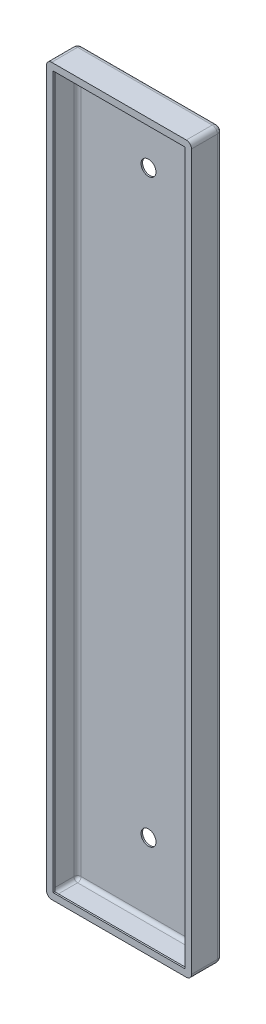
ISO-10303-21;
HEADER;
FILE_DESCRIPTION(('STEP AP214'),'2;1');
FILE_NAME('part.step','',(''),(''),'','','');
FILE_SCHEMA(('AUTOMOTIVE_DESIGN { 1 0 10303 214 1 1 1 1 }'));
ENDSEC;
DATA;
#1=APPLICATION_CONTEXT('core data for automotive mechanical design processes');
#2=APPLICATION_PROTOCOL_DEFINITION('international standard','automotive_design',2000,#1);
#3=PRODUCT_CONTEXT('',#1,'mechanical');
#4=PRODUCT('Part','Part','',(#3));
#5=PRODUCT_RELATED_PRODUCT_CATEGORY('part','',(#4));
#6=PRODUCT_DEFINITION_FORMATION('','',#4);
#7=PRODUCT_DEFINITION_CONTEXT('part definition',#1,'design');
#8=PRODUCT_DEFINITION('design','',#6,#7);
#9=PRODUCT_DEFINITION_SHAPE('','',#8);
#10=(LENGTH_UNIT() NAMED_UNIT(*) SI_UNIT(.MILLI.,.METRE.));
#11=(NAMED_UNIT(*) PLANE_ANGLE_UNIT() SI_UNIT($,.RADIAN.));
#12=(NAMED_UNIT(*) SI_UNIT($,.STERADIAN.) SOLID_ANGLE_UNIT());
#13=UNCERTAINTY_MEASURE_WITH_UNIT(LENGTH_MEASURE(1.E-05),#10,'distance_accuracy_value','');
#14=(GEOMETRIC_REPRESENTATION_CONTEXT(3) GLOBAL_UNCERTAINTY_ASSIGNED_CONTEXT((#13)) GLOBAL_UNIT_ASSIGNED_CONTEXT((#10,
#11,#12)) REPRESENTATION_CONTEXT('',''));
#15=CARTESIAN_POINT('',(0.,0.,0.));
#16=DIRECTION('',(0.,0.,1.));
#17=DIRECTION('',(1.,0.,0.));
#18=AXIS2_PLACEMENT_3D('',#15,#16,#17);
#19=CARTESIAN_POINT('',(350.,725.,63.7691453664121));
#20=DIRECTION('',(1.,0.,0.));
#21=DIRECTION('',(0.,1.,0.));
#22=AXIS2_PLACEMENT_3D('',#19,#20,#21);
#23=PLANE('',#22);
#24=DIRECTION('',(0.,0.,-1.));
#25=VECTOR('',#24,1.);
#26=CARTESIAN_POINT('',(350.,720.,63.7691453664121));
#27=LINE('',#26,#25);
#28=CARTESIAN_POINT('',(350.,720.,63.7691453664121));
#29=VERTEX_POINT('',#28);
#30=CARTESIAN_POINT('',(350.,720.,38.7691453664121));
#31=VERTEX_POINT('',#30);
#32=EDGE_CURVE('E376',#29,#31,#27,.T.);
#33=ORIENTED_EDGE('',*,*,#32,.T.);
#34=DIRECTION('',(0.,-1.,0.));
#35=VECTOR('',#34,1.);
#36=CARTESIAN_POINT('',(350.,725.,38.7691453664121));
#37=LINE('',#36,#35);
#38=CARTESIAN_POINT('',(350.,30.0000000000002,38.7691453664121));
#39=VERTEX_POINT('',#38);
#40=EDGE_CURVE('E378',#31,#39,#37,.T.);
#41=ORIENTED_EDGE('',*,*,#40,.T.);
#42=DIRECTION('',(0.,0.,-1.));
#43=VECTOR('',#42,1.);
#44=CARTESIAN_POINT('',(350.,30.0000000000002,63.7691453664121));
#45=LINE('',#44,#43);
#46=CARTESIAN_POINT('',(350.,30.0000000000002,63.7691453664121));
#47=VERTEX_POINT('',#46);
#48=EDGE_CURVE('E380',#39,#47,#45,.F.);
#49=ORIENTED_EDGE('',*,*,#48,.T.);
#50=DIRECTION('',(0.,-1.,0.));
#51=VECTOR('',#50,1.);
#52=CARTESIAN_POINT('',(350.,725.,63.7691453664121));
#53=LINE('',#52,#51);
#54=EDGE_CURVE('E335',#29,#47,#53,.T.);
#55=ORIENTED_EDGE('',*,*,#54,.F.);
#56=EDGE_LOOP('',(#33,#41,#49,#55));
#57=FACE_BOUND('',#56,.T.);
#58=ADVANCED_FACE('F39',(#57),#23,.F.);
#59=CARTESIAN_POINT('',(350.,25.0000000000002,63.7691453664121));
#60=DIRECTION('',(0.,1.,0.));
#61=DIRECTION('',(0.,0.,1.));
#62=AXIS2_PLACEMENT_3D('',#59,#60,#61);
#63=PLANE('',#62);
#64=DIRECTION('',(0.,0.,-1.));
#65=VECTOR('',#64,1.);
#66=CARTESIAN_POINT('',(355.,25.0000000000002,63.7691453664121));
#67=LINE('',#66,#65);
#68=CARTESIAN_POINT('',(355.,25.0000000000002,63.7691453664121));
#69=VERTEX_POINT('',#68);
#70=CARTESIAN_POINT('',(355.,25.0000000000002,38.7691453664121));
#71=VERTEX_POINT('',#70);
#72=EDGE_CURVE('E353',#69,#71,#67,.T.);
#73=ORIENTED_EDGE('',*,*,#72,.T.);
#74=DIRECTION('',(1.,0.,0.));
#75=VECTOR('',#74,1.);
#76=CARTESIAN_POINT('',(350.,25.0000000000002,38.7691453664121));
#77=LINE('',#76,#75);
#78=CARTESIAN_POINT('',(485.000000000006,25.0000000000002,38.7691453664121));
#79=VERTEX_POINT('',#78);
#80=EDGE_CURVE('E350',#71,#79,#77,.T.);
#81=ORIENTED_EDGE('',*,*,#80,.T.);
#82=DIRECTION('',(0.,0.,-1.));
#83=VECTOR('',#82,1.);
#84=CARTESIAN_POINT('',(485.000000000006,25.0000000000002,63.7691453664121));
#85=LINE('',#84,#83);
#86=CARTESIAN_POINT('',(485.000000000006,25.0000000000002,63.7691453664121));
#87=VERTEX_POINT('',#86);
#88=EDGE_CURVE('E348',#79,#87,#85,.F.);
#89=ORIENTED_EDGE('',*,*,#88,.T.);
#90=DIRECTION('',(1.,0.,0.));
#91=VECTOR('',#90,1.);
#92=CARTESIAN_POINT('',(350.,25.0000000000002,63.7691453664121));
#93=LINE('',#92,#91);
#94=EDGE_CURVE('E338',#69,#87,#93,.T.);
#95=ORIENTED_EDGE('',*,*,#94,.F.);
#96=EDGE_LOOP('',(#73,#81,#89,#95));
#97=FACE_BOUND('',#96,.T.);
#98=ADVANCED_FACE('F448',(#97),#63,.F.);
#99=CARTESIAN_POINT('',(490.000000000006,725.,63.7691453664121));
#100=DIRECTION('',(-1.,0.,0.));
#101=DIRECTION('',(0.,0.,1.));
#102=AXIS2_PLACEMENT_3D('',#99,#100,#101);
#103=PLANE('',#102);
#104=DIRECTION('',(0.,0.,-1.));
#105=VECTOR('',#104,1.);
#106=CARTESIAN_POINT('',(490.000000000006,30.0000000000002,63.7691453664121));
#107=LINE('',#106,#105);
#108=CARTESIAN_POINT('',(490.000000000006,30.0000000000002,63.7691453664121));
#109=VERTEX_POINT('',#108);
#110=CARTESIAN_POINT('',(490.000000000006,30.0000000000002,38.7691453664121));
#111=VERTEX_POINT('',#110);
#112=EDGE_CURVE('E368',#109,#111,#107,.T.);
#113=ORIENTED_EDGE('',*,*,#112,.T.);
#114=DIRECTION('',(0.,1.,0.));
#115=VECTOR('',#114,1.);
#116=CARTESIAN_POINT('',(490.000000000006,725.,38.7691453664121));
#117=LINE('',#116,#115);
#118=CARTESIAN_POINT('',(490.000000000006,720.,38.7691453664121));
#119=VERTEX_POINT('',#118);
#120=EDGE_CURVE('E366',#111,#119,#117,.T.);
#121=ORIENTED_EDGE('',*,*,#120,.T.);
#122=DIRECTION('',(0.,0.,-1.));
#123=VECTOR('',#122,1.);
#124=CARTESIAN_POINT('',(490.000000000006,720.,63.7691453664121));
#125=LINE('',#124,#123);
#126=CARTESIAN_POINT('',(490.000000000006,720.,63.7691453664121));
#127=VERTEX_POINT('',#126);
#128=EDGE_CURVE('E364',#119,#127,#125,.F.);
#129=ORIENTED_EDGE('',*,*,#128,.T.);
#130=DIRECTION('',(0.,1.,0.));
#131=VECTOR('',#130,1.);
#132=CARTESIAN_POINT('',(490.000000000006,725.,63.7691453664121));
#133=LINE('',#132,#131);
#134=EDGE_CURVE('E342',#109,#127,#133,.T.);
#135=ORIENTED_EDGE('',*,*,#134,.F.);
#136=EDGE_LOOP('',(#113,#121,#129,#135));
#137=FACE_BOUND('',#136,.T.);
#138=ADVANCED_FACE('F458',(#137),#103,.F.);
#139=CARTESIAN_POINT('',(350.,725.,63.7691453664121));
#140=DIRECTION('',(0.,-1.,0.));
#141=DIRECTION('',(0.,0.,-1.));
#142=AXIS2_PLACEMENT_3D('',#139,#140,#141);
#143=PLANE('',#142);
#144=DIRECTION('',(0.,0.,-1.));
#145=VECTOR('',#144,1.);
#146=CARTESIAN_POINT('',(485.000000000006,725.,63.7691453664121));
#147=LINE('',#146,#145);
#148=CARTESIAN_POINT('',(485.000000000006,725.,63.7691453664121));
#149=VERTEX_POINT('',#148);
#150=CARTESIAN_POINT('',(485.000000000006,725.,38.7691453664121));
#151=VERTEX_POINT('',#150);
#152=EDGE_CURVE('E370',#149,#151,#147,.T.);
#153=ORIENTED_EDGE('',*,*,#152,.T.);
#154=DIRECTION('',(-1.,0.,0.));
#155=VECTOR('',#154,1.);
#156=CARTESIAN_POINT('',(350.,725.,38.7691453664121));
#157=LINE('',#156,#155);
#158=CARTESIAN_POINT('',(355.,725.,38.7691453664121));
#159=VERTEX_POINT('',#158);
#160=EDGE_CURVE('E372',#151,#159,#157,.T.);
#161=ORIENTED_EDGE('',*,*,#160,.T.);
#162=DIRECTION('',(0.,0.,-1.));
#163=VECTOR('',#162,1.);
#164=CARTESIAN_POINT('',(355.,725.,63.7691453664121));
#165=LINE('',#164,#163);
#166=CARTESIAN_POINT('',(355.,725.,63.7691453664121));
#167=VERTEX_POINT('',#166);
#168=EDGE_CURVE('E374',#159,#167,#165,.F.);
#169=ORIENTED_EDGE('',*,*,#168,.T.);
#170=DIRECTION('',(-1.,0.,0.));
#171=VECTOR('',#170,1.);
#172=CARTESIAN_POINT('',(350.,725.,63.7691453664121));
#173=LINE('',#172,#171);
#174=EDGE_CURVE('E345',#149,#167,#173,.T.);
#175=ORIENTED_EDGE('',*,*,#174,.F.);
#176=EDGE_LOOP('',(#153,#161,#169,#175));
#177=FACE_BOUND('',#176,.T.);
#178=ADVANCED_FACE('F479',(#177),#143,.F.);
#179=CARTESIAN_POINT('',(0.,0.,63.7691453664121));
#180=DIRECTION('',(0.,0.,1.));
#181=DIRECTION('',(1.,0.,0.));
#182=AXIS2_PLACEMENT_3D('',#179,#180,#181);
#183=PLANE('',#182);
#184=ORIENTED_EDGE('',*,*,#54,.T.);
#185=CARTESIAN_POINT('',(355.,30.0000000000002,63.7691453664121));
#186=DIRECTION('',(0.,0.,1.));
#187=DIRECTION('',(1.,0.,0.));
#188=AXIS2_PLACEMENT_3D('',#185,#186,#187);
#189=CIRCLE('',#188,5.);
#190=EDGE_CURVE('E47',#47,#69,#189,.T.);
#191=ORIENTED_EDGE('',*,*,#190,.T.);
#192=ORIENTED_EDGE('',*,*,#94,.T.);
#193=CARTESIAN_POINT('',(485.000000000006,30.0000000000002,63.7691453664121));
#194=DIRECTION('',(0.,0.,1.));
#195=DIRECTION('',(1.,0.,0.));
#196=AXIS2_PLACEMENT_3D('',#193,#194,#195);
#197=CIRCLE('',#196,5.);
#198=EDGE_CURVE('E386',#87,#109,#197,.T.);
#199=ORIENTED_EDGE('',*,*,#198,.T.);
#200=ORIENTED_EDGE('',*,*,#134,.T.);
#201=CARTESIAN_POINT('',(485.000000000006,720.,63.7691453664121));
#202=DIRECTION('',(0.,0.,1.));
#203=DIRECTION('',(1.,0.,0.));
#204=AXIS2_PLACEMENT_3D('',#201,#202,#203);
#205=CIRCLE('',#204,5.);
#206=EDGE_CURVE('E382',#127,#149,#205,.T.);
#207=ORIENTED_EDGE('',*,*,#206,.T.);
#208=ORIENTED_EDGE('',*,*,#174,.T.);
#209=CARTESIAN_POINT('',(355.,720.,63.7691453664121));
#210=DIRECTION('',(0.,0.,1.));
#211=DIRECTION('',(1.,0.,0.));
#212=AXIS2_PLACEMENT_3D('',#209,#210,#211);
#213=CIRCLE('',#212,5.);
#214=EDGE_CURVE('E384',#167,#29,#213,.T.);
#215=ORIENTED_EDGE('',*,*,#214,.T.);
#216=EDGE_LOOP('',(#184,#191,#192,#199,#200,#207,#208,#215));
#217=FACE_BOUND('',#216,.T.);
#218=DIRECTION('',(0.,1.,0.));
#219=VECTOR('',#218,1.);
#220=CARTESIAN_POINT('',(483.500000000006,31.5000000000002,63.7691453664121));
#221=LINE('',#220,#219);
#222=CARTESIAN_POINT('',(483.500000000006,31.5000000000002,63.7691453664121));
#223=VERTEX_POINT('',#222);
#224=CARTESIAN_POINT('',(483.500000000006,718.5,63.7691453664121));
#225=VERTEX_POINT('',#224);
#226=EDGE_CURVE('E209',#223,#225,#221,.T.);
#227=ORIENTED_EDGE('',*,*,#226,.F.);
#228=DIRECTION('',(1.,0.,0.));
#229=VECTOR('',#228,1.);
#230=CARTESIAN_POINT('',(356.5,31.5000000000002,63.7691453664121));
#231=LINE('',#230,#229);
#232=CARTESIAN_POINT('',(356.5,31.5000000000002,63.7691453664121));
#233=VERTEX_POINT('',#232);
#234=EDGE_CURVE('E227',#233,#223,#231,.T.);
#235=ORIENTED_EDGE('',*,*,#234,.F.);
#236=DIRECTION('',(0.,-1.,0.));
#237=VECTOR('',#236,1.);
#238=CARTESIAN_POINT('',(356.5,718.5,63.7691453664121));
#239=LINE('',#238,#237);
#240=CARTESIAN_POINT('',(356.5,718.5,63.7691453664121));
#241=VERTEX_POINT('',#240);
#242=EDGE_CURVE('E230',#241,#233,#239,.T.);
#243=ORIENTED_EDGE('',*,*,#242,.F.);
#244=DIRECTION('',(-1.,0.,0.));
#245=VECTOR('',#244,1.);
#246=CARTESIAN_POINT('',(483.500000000006,718.5,63.7691453664121));
#247=LINE('',#246,#245);
#248=EDGE_CURVE('E239',#225,#241,#247,.T.);
#249=ORIENTED_EDGE('',*,*,#248,.F.);
#250=EDGE_LOOP('',(#227,#235,#243,#249));
#251=FACE_BOUND('',#250,.T.);
#252=ADVANCED_FACE('F444',(#217,#251),#183,.T.);
#253=CARTESIAN_POINT('',(0.,0.,33.7691453664121));
#254=DIRECTION('',(0.,0.,1.));
#255=DIRECTION('',(1.,0.,0.));
#256=AXIS2_PLACEMENT_3D('',#253,#254,#255);
#257=PLANE('',#256);
#258=CARTESIAN_POINT('',(420.000000000003,655.,33.7691453664121));
#259=DIRECTION('',(0.,0.,1.));
#260=DIRECTION('',(1.,0.,0.));
#261=AXIS2_PLACEMENT_3D('',#258,#259,#260);
#262=CIRCLE('',#261,7.22547934031754);
#263=CARTESIAN_POINT('',(427.225479340321,655.,33.7691453664121));
#264=VERTEX_POINT('',#263);
#265=EDGE_CURVE('E240',#264,#264,#262,.F.);
#266=ORIENTED_EDGE('',*,*,#265,.F.);
#267=EDGE_LOOP('',(#266));
#268=FACE_BOUND('',#267,.T.);
#269=CARTESIAN_POINT('',(420.000000000003,95.0000000000002,33.7691453664121));
#270=DIRECTION('',(0.,0.,1.));
#271=DIRECTION('',(1.,0.,0.));
#272=AXIS2_PLACEMENT_3D('',#269,#270,#271);
#273=CIRCLE('',#272,7.22547934031754);
#274=CARTESIAN_POINT('',(427.225479340321,95.0000000000002,33.7691453664121));
#275=VERTEX_POINT('',#274);
#276=EDGE_CURVE('E233',#275,#275,#273,.F.);
#277=ORIENTED_EDGE('',*,*,#276,.F.);
#278=EDGE_LOOP('',(#277));
#279=FACE_BOUND('',#278,.T.);
#280=DIRECTION('',(0.,1.,0.));
#281=VECTOR('',#280,1.);
#282=CARTESIAN_POINT('',(485.000000000006,0.,33.7691453664121));
#283=LINE('',#282,#281);
#284=CARTESIAN_POINT('',(485.000000000006,720.,33.7691453664121));
#285=VERTEX_POINT('',#284);
#286=CARTESIAN_POINT('',(485.000000000006,30.0000000000002,33.7691453664121));
#287=VERTEX_POINT('',#286);
#288=EDGE_CURVE('E359',#285,#287,#283,.F.);
#289=ORIENTED_EDGE('',*,*,#288,.T.);
#290=DIRECTION('',(1.,0.,0.));
#291=VECTOR('',#290,1.);
#292=CARTESIAN_POINT('',(0.,30.0000000000002,33.7691453664121));
#293=LINE('',#292,#291);
#294=CARTESIAN_POINT('',(355.,30.0000000000002,33.7691453664121));
#295=VERTEX_POINT('',#294);
#296=EDGE_CURVE('E361',#287,#295,#293,.F.);
#297=ORIENTED_EDGE('',*,*,#296,.T.);
#298=DIRECTION('',(0.,-1.,0.));
#299=VECTOR('',#298,1.);
#300=CARTESIAN_POINT('',(355.,0.,33.7691453664121));
#301=LINE('',#300,#299);
#302=CARTESIAN_POINT('',(355.,720.,33.7691453664121));
#303=VERTEX_POINT('',#302);
#304=EDGE_CURVE('E355',#295,#303,#301,.F.);
#305=ORIENTED_EDGE('',*,*,#304,.T.);
#306=DIRECTION('',(-1.,0.,0.));
#307=VECTOR('',#306,1.);
#308=CARTESIAN_POINT('',(0.,720.,33.7691453664121));
#309=LINE('',#308,#307);
#310=EDGE_CURVE('E357',#303,#285,#309,.F.);
#311=ORIENTED_EDGE('',*,*,#310,.T.);
#312=EDGE_LOOP('',(#289,#297,#305,#311));
#313=FACE_BOUND('',#312,.T.);
#314=ADVANCED_FACE('F475',(#268,#279,#313),#257,.F.);
#315=CARTESIAN_POINT('',(355.,720.,63.7691453664121));
#316=DIRECTION('',(0.,0.,-1.));
#317=DIRECTION('',(-1.,0.,0.));
#318=AXIS2_PLACEMENT_3D('',#315,#316,#317);
#319=CYLINDRICAL_SURFACE('',#318,5.);
#320=ORIENTED_EDGE('',*,*,#214,.F.);
#321=ORIENTED_EDGE('',*,*,#168,.F.);
#322=CARTESIAN_POINT('',(355.,720.,38.7691453664121));
#323=DIRECTION('',(0.,0.,-1.));
#324=DIRECTION('',(-1.,0.,0.));
#325=AXIS2_PLACEMENT_3D('',#322,#323,#324);
#326=CIRCLE('',#325,5.);
#327=EDGE_CURVE('E416',#31,#159,#326,.T.);
#328=ORIENTED_EDGE('',*,*,#327,.F.);
#329=ORIENTED_EDGE('',*,*,#32,.F.);
#330=EDGE_LOOP('',(#320,#321,#328,#329));
#331=FACE_BOUND('',#330,.T.);
#332=ADVANCED_FACE('F41',(#331),#319,.T.);
#333=CARTESIAN_POINT('',(485.000000000006,720.,63.7691453664121));
#334=DIRECTION('',(0.,0.,-1.));
#335=DIRECTION('',(-1.,0.,0.));
#336=AXIS2_PLACEMENT_3D('',#333,#334,#335);
#337=CYLINDRICAL_SURFACE('',#336,5.);
#338=ORIENTED_EDGE('',*,*,#206,.F.);
#339=ORIENTED_EDGE('',*,*,#128,.F.);
#340=CARTESIAN_POINT('',(485.000000000006,720.,38.7691453664121));
#341=DIRECTION('',(0.,0.,-1.));
#342=DIRECTION('',(-1.,0.,0.));
#343=AXIS2_PLACEMENT_3D('',#340,#341,#342);
#344=CIRCLE('',#343,5.);
#345=EDGE_CURVE('E413',#151,#119,#344,.T.);
#346=ORIENTED_EDGE('',*,*,#345,.F.);
#347=ORIENTED_EDGE('',*,*,#152,.F.);
#348=EDGE_LOOP('',(#338,#339,#346,#347));
#349=FACE_BOUND('',#348,.T.);
#350=ADVANCED_FACE('F463',(#349),#337,.T.);
#351=CARTESIAN_POINT('',(350.,720.,38.7691453664121));
#352=DIRECTION('',(-1.,0.,0.));
#353=DIRECTION('',(0.,0.,1.));
#354=AXIS2_PLACEMENT_3D('',#351,#352,#353);
#355=CYLINDRICAL_SURFACE('',#354,5.);
#356=CARTESIAN_POINT('',(355.,720.,38.7691453664121));
#357=DIRECTION('',(-1.,0.,0.));
#358=DIRECTION('',(0.,0.,1.));
#359=AXIS2_PLACEMENT_3D('',#356,#357,#358);
#360=CIRCLE('',#359,5.);
#361=EDGE_CURVE('E339',#159,#303,#360,.T.);
#362=ORIENTED_EDGE('',*,*,#361,.F.);
#363=ORIENTED_EDGE('',*,*,#160,.F.);
#364=CARTESIAN_POINT('',(485.000000000006,720.,38.7691453664121));
#365=DIRECTION('',(1.,0.,0.));
#366=DIRECTION('',(0.,0.,-1.));
#367=AXIS2_PLACEMENT_3D('',#364,#365,#366);
#368=CIRCLE('',#367,5.);
#369=EDGE_CURVE('E410',#285,#151,#368,.T.);
#370=ORIENTED_EDGE('',*,*,#369,.F.);
#371=ORIENTED_EDGE('',*,*,#310,.F.);
#372=EDGE_LOOP('',(#362,#363,#370,#371));
#373=FACE_BOUND('',#372,.T.);
#374=ADVANCED_FACE('F476',(#373),#355,.T.);
#375=CARTESIAN_POINT('',(355.,720.,38.7691453664121));
#376=DIRECTION('',(0.,1.,0.));
#377=DIRECTION('',(0.,0.,1.));
#378=AXIS2_PLACEMENT_3D('',#375,#376,#377);
#379=SPHERICAL_SURFACE('',#378,5.);
#380=ORIENTED_EDGE('',*,*,#327,.T.);
#381=ORIENTED_EDGE('',*,*,#361,.T.);
#382=CARTESIAN_POINT('',(355.,720.,38.7691453664121));
#383=DIRECTION('',(0.,1.,0.));
#384=DIRECTION('',(0.,0.,1.));
#385=AXIS2_PLACEMENT_3D('',#382,#383,#384);
#386=CIRCLE('',#385,5.);
#387=EDGE_CURVE('E407',#31,#303,#386,.F.);
#388=ORIENTED_EDGE('',*,*,#387,.F.);
#389=EDGE_LOOP('',(#380,#381,#388));
#390=FACE_BOUND('',#389,.T.);
#391=ADVANCED_FACE('F422',(#390),#379,.T.);
#392=CARTESIAN_POINT('',(485.000000000006,720.,38.7691453664121));
#393=DIRECTION('',(0.,1.,0.));
#394=DIRECTION('',(0.,0.,1.));
#395=AXIS2_PLACEMENT_3D('',#392,#393,#394);
#396=SPHERICAL_SURFACE('',#395,5.);
#397=ORIENTED_EDGE('',*,*,#369,.T.);
#398=ORIENTED_EDGE('',*,*,#345,.T.);
#399=CARTESIAN_POINT('',(485.000000000006,720.,38.7691453664121));
#400=DIRECTION('',(0.,1.,0.));
#401=DIRECTION('',(0.,0.,1.));
#402=AXIS2_PLACEMENT_3D('',#399,#400,#401);
#403=CIRCLE('',#402,5.);
#404=EDGE_CURVE('E404',#285,#119,#403,.F.);
#405=ORIENTED_EDGE('',*,*,#404,.F.);
#406=EDGE_LOOP('',(#397,#398,#405));
#407=FACE_BOUND('',#406,.T.);
#408=ADVANCED_FACE('F467',(#407),#396,.T.);
#409=CARTESIAN_POINT('',(355.,725.,38.7691453664121));
#410=DIRECTION('',(0.,-1.,0.));
#411=DIRECTION('',(1.,0.,0.));
#412=AXIS2_PLACEMENT_3D('',#409,#410,#411);
#413=CYLINDRICAL_SURFACE('',#412,5.);
#414=ORIENTED_EDGE('',*,*,#387,.T.);
#415=ORIENTED_EDGE('',*,*,#304,.F.);
#416=CARTESIAN_POINT('',(355.,30.0000000000002,38.7691453664121));
#417=DIRECTION('',(0.,-1.,0.));
#418=DIRECTION('',(0.,0.,-1.));
#419=AXIS2_PLACEMENT_3D('',#416,#417,#418);
#420=CIRCLE('',#419,5.);
#421=EDGE_CURVE('E401',#39,#295,#420,.T.);
#422=ORIENTED_EDGE('',*,*,#421,.F.);
#423=ORIENTED_EDGE('',*,*,#40,.F.);
#424=EDGE_LOOP('',(#414,#415,#422,#423));
#425=FACE_BOUND('',#424,.T.);
#426=ADVANCED_FACE('F430',(#425),#413,.T.);
#427=CARTESIAN_POINT('',(355.,30.0000000000002,63.7691453664121));
#428=DIRECTION('',(0.,0.,-1.));
#429=DIRECTION('',(-1.,0.,0.));
#430=AXIS2_PLACEMENT_3D('',#427,#428,#429);
#431=CYLINDRICAL_SURFACE('',#430,5.);
#432=ORIENTED_EDGE('',*,*,#190,.F.);
#433=ORIENTED_EDGE('',*,*,#48,.F.);
#434=CARTESIAN_POINT('',(355.,30.0000000000002,38.7691453664121));
#435=DIRECTION('',(0.,0.,-1.));
#436=DIRECTION('',(-1.,0.,0.));
#437=AXIS2_PLACEMENT_3D('',#434,#435,#436);
#438=CIRCLE('',#437,5.);
#439=EDGE_CURVE('E398',#71,#39,#438,.T.);
#440=ORIENTED_EDGE('',*,*,#439,.F.);
#441=ORIENTED_EDGE('',*,*,#72,.F.);
#442=EDGE_LOOP('',(#432,#433,#440,#441));
#443=FACE_BOUND('',#442,.T.);
#444=ADVANCED_FACE('F439',(#443),#431,.T.);
#445=CARTESIAN_POINT('',(485.000000000006,30.0000000000002,63.7691453664121));
#446=DIRECTION('',(0.,0.,-1.));
#447=DIRECTION('',(-1.,0.,0.));
#448=AXIS2_PLACEMENT_3D('',#445,#446,#447);
#449=CYLINDRICAL_SURFACE('',#448,5.);
#450=ORIENTED_EDGE('',*,*,#198,.F.);
#451=ORIENTED_EDGE('',*,*,#88,.F.);
#452=CARTESIAN_POINT('',(485.000000000006,30.0000000000002,38.7691453664121));
#453=DIRECTION('',(0.,0.,-1.));
#454=DIRECTION('',(-1.,0.,0.));
#455=AXIS2_PLACEMENT_3D('',#452,#453,#454);
#456=CIRCLE('',#455,5.);
#457=EDGE_CURVE('E395',#111,#79,#456,.T.);
#458=ORIENTED_EDGE('',*,*,#457,.F.);
#459=ORIENTED_EDGE('',*,*,#112,.F.);
#460=EDGE_LOOP('',(#450,#451,#458,#459));
#461=FACE_BOUND('',#460,.T.);
#462=ADVANCED_FACE('F453',(#461),#449,.T.);
#463=CARTESIAN_POINT('',(485.000000000006,725.,38.7691453664121));
#464=DIRECTION('',(0.,1.,0.));
#465=DIRECTION('',(0.,0.,1.));
#466=AXIS2_PLACEMENT_3D('',#463,#464,#465);
#467=CYLINDRICAL_SURFACE('',#466,5.);
#468=ORIENTED_EDGE('',*,*,#404,.T.);
#469=ORIENTED_EDGE('',*,*,#120,.F.);
#470=CARTESIAN_POINT('',(485.000000000006,30.0000000000002,38.7691453664121));
#471=DIRECTION('',(0.,-1.,0.));
#472=DIRECTION('',(1.,0.,0.));
#473=AXIS2_PLACEMENT_3D('',#470,#471,#472);
#474=CIRCLE('',#473,5.);
#475=EDGE_CURVE('E392',#287,#111,#474,.T.);
#476=ORIENTED_EDGE('',*,*,#475,.F.);
#477=ORIENTED_EDGE('',*,*,#288,.F.);
#478=EDGE_LOOP('',(#468,#469,#476,#477));
#479=FACE_BOUND('',#478,.T.);
#480=ADVANCED_FACE('F471',(#479),#467,.T.);
#481=CARTESIAN_POINT('',(355.,30.0000000000002,38.7691453664121));
#482=DIRECTION('',(-1.,0.,0.));
#483=DIRECTION('',(0.,0.,1.));
#484=AXIS2_PLACEMENT_3D('',#481,#482,#483);
#485=SPHERICAL_SURFACE('',#484,5.);
#486=ORIENTED_EDGE('',*,*,#439,.T.);
#487=ORIENTED_EDGE('',*,*,#421,.T.);
#488=CARTESIAN_POINT('',(355.,30.0000000000002,38.7691453664121));
#489=DIRECTION('',(-1.,0.,0.));
#490=DIRECTION('',(0.,0.,1.));
#491=AXIS2_PLACEMENT_3D('',#488,#489,#490);
#492=CIRCLE('',#491,5.);
#493=EDGE_CURVE('E390',#71,#295,#492,.F.);
#494=ORIENTED_EDGE('',*,*,#493,.F.);
#495=EDGE_LOOP('',(#486,#487,#494));
#496=FACE_BOUND('',#495,.T.);
#497=ADVANCED_FACE('F505',(#496),#485,.T.);
#498=CARTESIAN_POINT('',(485.000000000006,30.0000000000002,38.7691453664121));
#499=DIRECTION('',(1.,0.,0.));
#500=DIRECTION('',(0.,1.,0.));
#501=AXIS2_PLACEMENT_3D('',#498,#499,#500);
#502=SPHERICAL_SURFACE('',#501,5.);
#503=ORIENTED_EDGE('',*,*,#475,.T.);
#504=ORIENTED_EDGE('',*,*,#457,.T.);
#505=CARTESIAN_POINT('',(485.000000000006,30.0000000000002,38.7691453664121));
#506=DIRECTION('',(1.,0.,0.));
#507=DIRECTION('',(0.,0.,-1.));
#508=AXIS2_PLACEMENT_3D('',#505,#506,#507);
#509=CIRCLE('',#508,5.);
#510=EDGE_CURVE('E271',#287,#79,#509,.F.);
#511=ORIENTED_EDGE('',*,*,#510,.F.);
#512=EDGE_LOOP('',(#503,#504,#511));
#513=FACE_BOUND('',#512,.T.);
#514=ADVANCED_FACE('F501',(#513),#502,.T.);
#515=CARTESIAN_POINT('',(350.,30.0000000000002,38.7691453664121));
#516=DIRECTION('',(1.,0.,0.));
#517=DIRECTION('',(0.,0.,-1.));
#518=AXIS2_PLACEMENT_3D('',#515,#516,#517);
#519=CYLINDRICAL_SURFACE('',#518,5.);
#520=ORIENTED_EDGE('',*,*,#493,.T.);
#521=ORIENTED_EDGE('',*,*,#296,.F.);
#522=ORIENTED_EDGE('',*,*,#510,.T.);
#523=ORIENTED_EDGE('',*,*,#80,.F.);
#524=EDGE_LOOP('',(#520,#521,#522,#523));
#525=FACE_BOUND('',#524,.T.);
#526=ADVANCED_FACE('F498',(#525),#519,.T.);
#527=CARTESIAN_POINT('',(355.,720.,62.2691453664121));
#528=DIRECTION('',(0.,0.,1.));
#529=DIRECTION('',(1.,0.,0.));
#530=AXIS2_PLACEMENT_3D('',#527,#528,#529);
#531=PLANE('',#530);
#532=DIRECTION('',(1.,0.,0.));
#533=VECTOR('',#532,1.);
#534=CARTESIAN_POINT('',(356.5,31.5000000000002,62.2691453664121));
#535=LINE('',#534,#533);
#536=CARTESIAN_POINT('',(356.5,31.5000000000002,62.2691453664121));
#537=VERTEX_POINT('',#536);
#538=CARTESIAN_POINT('',(483.500000000006,31.5000000000002,62.2691453664121));
#539=VERTEX_POINT('',#538);
#540=EDGE_CURVE('E214',#537,#539,#535,.T.);
#541=ORIENTED_EDGE('',*,*,#540,.T.);
#542=DIRECTION('',(0.,1.,0.));
#543=VECTOR('',#542,1.);
#544=CARTESIAN_POINT('',(483.500000000006,31.5000000000002,62.2691453664121));
#545=LINE('',#544,#543);
#546=CARTESIAN_POINT('',(483.500000000006,718.5,62.2691453664121));
#547=VERTEX_POINT('',#546);
#548=EDGE_CURVE('E206',#539,#547,#545,.T.);
#549=ORIENTED_EDGE('',*,*,#548,.T.);
#550=DIRECTION('',(-1.,0.,0.));
#551=VECTOR('',#550,1.);
#552=CARTESIAN_POINT('',(483.500000000006,718.5,62.2691453664121));
#553=LINE('',#552,#551);
#554=CARTESIAN_POINT('',(356.5,718.5,62.2691453664121));
#555=VERTEX_POINT('',#554);
#556=EDGE_CURVE('E218',#547,#555,#553,.T.);
#557=ORIENTED_EDGE('',*,*,#556,.T.);
#558=DIRECTION('',(0.,-1.,0.));
#559=VECTOR('',#558,1.);
#560=CARTESIAN_POINT('',(356.5,718.5,62.2691453664121));
#561=LINE('',#560,#559);
#562=EDGE_CURVE('E222',#555,#537,#561,.T.);
#563=ORIENTED_EDGE('',*,*,#562,.T.);
#564=EDGE_LOOP('',(#541,#549,#557,#563));
#565=FACE_BOUND('',#564,.T.);
#566=DIRECTION('',(0.,-1.,0.));
#567=VECTOR('',#566,1.);
#568=CARTESIAN_POINT('',(351.5,725.,62.2691453664121));
#569=LINE('',#568,#567);
#570=CARTESIAN_POINT('',(351.5,720.,62.2691453664121));
#571=VERTEX_POINT('',#570);
#572=CARTESIAN_POINT('',(351.5,30.0000000000002,62.2691453664121));
#573=VERTEX_POINT('',#572);
#574=EDGE_CURVE('E261',#571,#573,#569,.T.);
#575=ORIENTED_EDGE('',*,*,#574,.F.);
#576=CARTESIAN_POINT('',(355.,720.,62.2691453664121));
#577=DIRECTION('',(0.,0.,1.));
#578=DIRECTION('',(1.,0.,0.));
#579=AXIS2_PLACEMENT_3D('',#576,#577,#578);
#580=CIRCLE('',#579,3.5);
#581=CARTESIAN_POINT('',(355.,723.5,62.2691453664121));
#582=VERTEX_POINT('',#581);
#583=EDGE_CURVE('E61',#571,#582,#580,.F.);
#584=ORIENTED_EDGE('',*,*,#583,.T.);
#585=DIRECTION('',(-1.,0.,0.));
#586=VECTOR('',#585,1.);
#587=CARTESIAN_POINT('',(350.,723.5,62.2691453664121));
#588=LINE('',#587,#586);
#589=CARTESIAN_POINT('',(485.000000000006,723.5,62.2691453664121));
#590=VERTEX_POINT('',#589);
#591=EDGE_CURVE('E54',#590,#582,#588,.T.);
#592=ORIENTED_EDGE('',*,*,#591,.F.);
#593=CARTESIAN_POINT('',(485.000000000006,720.,62.2691453664121));
#594=DIRECTION('',(0.,0.,1.));
#595=DIRECTION('',(1.,0.,0.));
#596=AXIS2_PLACEMENT_3D('',#593,#594,#595);
#597=CIRCLE('',#596,3.5);
#598=CARTESIAN_POINT('',(488.500000000006,720.,62.2691453664121));
#599=VERTEX_POINT('',#598);
#600=EDGE_CURVE('E257',#590,#599,#597,.F.);
#601=ORIENTED_EDGE('',*,*,#600,.T.);
#602=DIRECTION('',(0.,1.,0.));
#603=VECTOR('',#602,1.);
#604=CARTESIAN_POINT('',(488.500000000006,725.,62.2691453664121));
#605=LINE('',#604,#603);
#606=CARTESIAN_POINT('',(488.500000000006,30.0000000000002,62.2691453664121));
#607=VERTEX_POINT('',#606);
#608=EDGE_CURVE('E246',#607,#599,#605,.T.);
#609=ORIENTED_EDGE('',*,*,#608,.F.);
#610=CARTESIAN_POINT('',(485.000000000006,30.0000000000002,62.2691453664121));
#611=DIRECTION('',(0.,0.,1.));
#612=DIRECTION('',(1.,0.,0.));
#613=AXIS2_PLACEMENT_3D('',#610,#611,#612);
#614=CIRCLE('',#613,3.5);
#615=CARTESIAN_POINT('',(485.000000000006,26.5000000000002,62.2691453664121));
#616=VERTEX_POINT('',#615);
#617=EDGE_CURVE('E11',#607,#616,#614,.F.);
#618=ORIENTED_EDGE('',*,*,#617,.T.);
#619=DIRECTION('',(1.,0.,0.));
#620=VECTOR('',#619,1.);
#621=CARTESIAN_POINT('',(350.,26.5000000000002,62.2691453664121));
#622=LINE('',#621,#620);
#623=CARTESIAN_POINT('',(355.,26.5000000000002,62.2691453664121));
#624=VERTEX_POINT('',#623);
#625=EDGE_CURVE('E251',#624,#616,#622,.T.);
#626=ORIENTED_EDGE('',*,*,#625,.F.);
#627=CARTESIAN_POINT('',(355.,30.0000000000002,62.2691453664121));
#628=DIRECTION('',(0.,0.,1.));
#629=DIRECTION('',(1.,0.,0.));
#630=AXIS2_PLACEMENT_3D('',#627,#628,#629);
#631=CIRCLE('',#630,3.5);
#632=EDGE_CURVE('E254',#624,#573,#631,.F.);
#633=ORIENTED_EDGE('',*,*,#632,.T.);
#634=EDGE_LOOP('',(#575,#584,#592,#601,#609,#618,#626,#633));
#635=FACE_BOUND('',#634,.T.);
#636=ADVANCED_FACE('F224',(#565,#635),#531,.F.);
#637=CARTESIAN_POINT('',(483.500000000006,31.5000000000002,62.2691453664121));
#638=DIRECTION('',(1.,0.,0.));
#639=DIRECTION('',(0.,0.,-1.));
#640=AXIS2_PLACEMENT_3D('',#637,#638,#639);
#641=PLANE('',#640);
#642=ORIENTED_EDGE('',*,*,#226,.T.);
#643=DIRECTION('',(0.,0.,1.));
#644=VECTOR('',#643,1.);
#645=CARTESIAN_POINT('',(483.500000000006,718.5,62.2691453664121));
#646=LINE('',#645,#644);
#647=EDGE_CURVE('E202',#547,#225,#646,.T.);
#648=ORIENTED_EDGE('',*,*,#647,.F.);
#649=ORIENTED_EDGE('',*,*,#548,.F.);
#650=DIRECTION('',(0.,0.,1.));
#651=VECTOR('',#650,1.);
#652=CARTESIAN_POINT('',(483.500000000006,31.5000000000002,62.2691453664121));
#653=LINE('',#652,#651);
#654=EDGE_CURVE('E244',#539,#223,#653,.T.);
#655=ORIENTED_EDGE('',*,*,#654,.T.);
#656=EDGE_LOOP('',(#642,#648,#649,#655));
#657=FACE_BOUND('',#656,.T.);
#658=ADVANCED_FACE('F204',(#657),#641,.F.);
#659=CARTESIAN_POINT('',(356.5,31.5000000000002,62.2691453664121));
#660=DIRECTION('',(0.,-1.,0.));
#661=DIRECTION('',(0.,0.,-1.));
#662=AXIS2_PLACEMENT_3D('',#659,#660,#661);
#663=PLANE('',#662);
#664=ORIENTED_EDGE('',*,*,#234,.T.);
#665=ORIENTED_EDGE('',*,*,#654,.F.);
#666=ORIENTED_EDGE('',*,*,#540,.F.);
#667=DIRECTION('',(0.,0.,1.));
#668=VECTOR('',#667,1.);
#669=CARTESIAN_POINT('',(356.5,31.5000000000002,62.2691453664121));
#670=LINE('',#669,#668);
#671=EDGE_CURVE('E247',#537,#233,#670,.T.);
#672=ORIENTED_EDGE('',*,*,#671,.T.);
#673=EDGE_LOOP('',(#664,#665,#666,#672));
#674=FACE_BOUND('',#673,.T.);
#675=ADVANCED_FACE('F586',(#674),#663,.F.);
#676=CARTESIAN_POINT('',(356.5,718.5,62.2691453664121));
#677=DIRECTION('',(-1.,0.,0.));
#678=DIRECTION('',(0.,0.,1.));
#679=AXIS2_PLACEMENT_3D('',#676,#677,#678);
#680=PLANE('',#679);
#681=ORIENTED_EDGE('',*,*,#242,.T.);
#682=ORIENTED_EDGE('',*,*,#671,.F.);
#683=ORIENTED_EDGE('',*,*,#562,.F.);
#684=DIRECTION('',(0.,0.,1.));
#685=VECTOR('',#684,1.);
#686=CARTESIAN_POINT('',(356.5,718.5,62.2691453664121));
#687=LINE('',#686,#685);
#688=EDGE_CURVE('E213',#555,#241,#687,.T.);
#689=ORIENTED_EDGE('',*,*,#688,.T.);
#690=EDGE_LOOP('',(#681,#682,#683,#689));
#691=FACE_BOUND('',#690,.T.);
#692=ADVANCED_FACE('F594',(#691),#680,.F.);
#693=CARTESIAN_POINT('',(483.500000000006,718.5,62.2691453664121));
#694=DIRECTION('',(0.,1.,0.));
#695=DIRECTION('',(0.,0.,1.));
#696=AXIS2_PLACEMENT_3D('',#693,#694,#695);
#697=PLANE('',#696);
#698=ORIENTED_EDGE('',*,*,#248,.T.);
#699=ORIENTED_EDGE('',*,*,#688,.F.);
#700=ORIENTED_EDGE('',*,*,#556,.F.);
#701=ORIENTED_EDGE('',*,*,#647,.T.);
#702=EDGE_LOOP('',(#698,#699,#700,#701));
#703=FACE_BOUND('',#702,.T.);
#704=ADVANCED_FACE('F219',(#703),#697,.F.);
#705=CARTESIAN_POINT('',(0.,0.,35.2691453664121));
#706=DIRECTION('',(0.,0.,1.));
#707=DIRECTION('',(1.,0.,0.));
#708=AXIS2_PLACEMENT_3D('',#705,#706,#707);
#709=PLANE('',#708);
#710=CARTESIAN_POINT('',(420.000000000003,655.,35.2691453664121));
#711=DIRECTION('',(0.,0.,1.));
#712=DIRECTION('',(1.,0.,0.));
#713=AXIS2_PLACEMENT_3D('',#710,#711,#712);
#714=CIRCLE('',#713,7.22547934031754);
#715=CARTESIAN_POINT('',(427.225479340321,655.,35.2691453664121));
#716=VERTEX_POINT('',#715);
#717=EDGE_CURVE('E872',#716,#716,#714,.T.);
#718=ORIENTED_EDGE('',*,*,#717,.F.);
#719=EDGE_LOOP('',(#718));
#720=FACE_BOUND('',#719,.T.);
#721=CARTESIAN_POINT('',(420.000000000003,95.0000000000002,35.2691453664121));
#722=DIRECTION('',(0.,0.,1.));
#723=DIRECTION('',(-1.,0.,0.));
#724=AXIS2_PLACEMENT_3D('',#721,#722,#723);
#725=CIRCLE('',#724,7.22547934031754);
#726=CARTESIAN_POINT('',(412.774520659686,95.0000000000002,35.2691453664121));
#727=VERTEX_POINT('',#726);
#728=EDGE_CURVE('E876',#727,#727,#725,.T.);
#729=ORIENTED_EDGE('',*,*,#728,.F.);
#730=EDGE_LOOP('',(#729));
#731=FACE_BOUND('',#730,.T.);
#732=DIRECTION('',(0.,1.,0.));
#733=VECTOR('',#732,1.);
#734=CARTESIAN_POINT('',(485.000000000006,0.,35.2691453664121));
#735=LINE('',#734,#733);
#736=CARTESIAN_POINT('',(485.000000000006,720.,35.2691453664121));
#737=VERTEX_POINT('',#736);
#738=CARTESIAN_POINT('',(485.000000000006,30.0000000000002,35.2691453664121));
#739=VERTEX_POINT('',#738);
#740=EDGE_CURVE('E302',#737,#739,#735,.F.);
#741=ORIENTED_EDGE('',*,*,#740,.F.);
#742=DIRECTION('',(1.,0.,0.));
#743=VECTOR('',#742,1.);
#744=CARTESIAN_POINT('',(0.,720.,35.2691453664121));
#745=LINE('',#744,#743);
#746=CARTESIAN_POINT('',(355.,720.,35.2691453664121));
#747=VERTEX_POINT('',#746);
#748=EDGE_CURVE('E304',#747,#737,#745,.T.);
#749=ORIENTED_EDGE('',*,*,#748,.F.);
#750=DIRECTION('',(0.,1.,0.));
#751=VECTOR('',#750,1.);
#752=CARTESIAN_POINT('',(355.,0.,35.2691453664121));
#753=LINE('',#752,#751);
#754=CARTESIAN_POINT('',(355.,30.0000000000002,35.2691453664121));
#755=VERTEX_POINT('',#754);
#756=EDGE_CURVE('E307',#755,#747,#753,.T.);
#757=ORIENTED_EDGE('',*,*,#756,.F.);
#758=DIRECTION('',(1.,0.,0.));
#759=VECTOR('',#758,1.);
#760=CARTESIAN_POINT('',(0.,30.0000000000002,35.2691453664121));
#761=LINE('',#760,#759);
#762=EDGE_CURVE('E289',#739,#755,#761,.F.);
#763=ORIENTED_EDGE('',*,*,#762,.F.);
#764=EDGE_LOOP('',(#741,#749,#757,#763));
#765=FACE_BOUND('',#764,.T.);
#766=ADVANCED_FACE('F611',(#720,#731,#765),#709,.T.);
#767=CARTESIAN_POINT('',(355.,725.,38.7691453664121));
#768=DIRECTION('',(0.,-1.,0.));
#769=DIRECTION('',(1.,0.,0.));
#770=AXIS2_PLACEMENT_3D('',#767,#768,#769);
#771=CYLINDRICAL_SURFACE('',#770,3.5);
#772=CARTESIAN_POINT('',(355.,720.,38.7691453664121));
#773=DIRECTION('',(0.,-1.,0.));
#774=DIRECTION('',(1.,0.,0.));
#775=AXIS2_PLACEMENT_3D('',#772,#773,#774);
#776=CIRCLE('',#775,3.5);
#777=CARTESIAN_POINT('',(351.5,720.,38.7691453664121));
#778=VERTEX_POINT('',#777);
#779=EDGE_CURVE('E297',#778,#747,#776,.T.);
#780=ORIENTED_EDGE('',*,*,#779,.F.);
#781=DIRECTION('',(0.,1.,0.));
#782=VECTOR('',#781,1.);
#783=CARTESIAN_POINT('',(351.5,725.,38.7691453664121));
#784=LINE('',#783,#782);
#785=CARTESIAN_POINT('',(351.5,30.0000000000002,38.7691453664121));
#786=VERTEX_POINT('',#785);
#787=EDGE_CURVE('E265',#778,#786,#784,.F.);
#788=ORIENTED_EDGE('',*,*,#787,.T.);
#789=CARTESIAN_POINT('',(355.,30.0000000000002,38.7691453664121));
#790=DIRECTION('',(0.,1.,0.));
#791=DIRECTION('',(0.,0.,1.));
#792=AXIS2_PLACEMENT_3D('',#789,#790,#791);
#793=CIRCLE('',#792,3.5);
#794=EDGE_CURVE('E301',#786,#755,#793,.F.);
#795=ORIENTED_EDGE('',*,*,#794,.T.);
#796=ORIENTED_EDGE('',*,*,#756,.T.);
#797=EDGE_LOOP('',(#780,#788,#795,#796));
#798=FACE_BOUND('',#797,.T.);
#799=ADVANCED_FACE('F619',(#798),#771,.F.);
#800=CARTESIAN_POINT('',(350.,30.0000000000002,38.7691453664121));
#801=DIRECTION('',(1.,0.,0.));
#802=DIRECTION('',(0.,0.,-1.));
#803=AXIS2_PLACEMENT_3D('',#800,#801,#802);
#804=CYLINDRICAL_SURFACE('',#803,3.5);
#805=CARTESIAN_POINT('',(355.,30.0000000000002,38.7691453664121));
#806=DIRECTION('',(1.,0.,0.));
#807=DIRECTION('',(0.,0.,-1.));
#808=AXIS2_PLACEMENT_3D('',#805,#806,#807);
#809=CIRCLE('',#808,3.5);
#810=CARTESIAN_POINT('',(355.,26.5000000000002,38.7691453664121));
#811=VERTEX_POINT('',#810);
#812=EDGE_CURVE('E332',#811,#755,#809,.T.);
#813=ORIENTED_EDGE('',*,*,#812,.F.);
#814=DIRECTION('',(1.,0.,0.));
#815=VECTOR('',#814,1.);
#816=CARTESIAN_POINT('',(350.,26.5000000000002,38.7691453664121));
#817=LINE('',#816,#815);
#818=CARTESIAN_POINT('',(485.000000000006,26.5000000000002,38.7691453664121));
#819=VERTEX_POINT('',#818);
#820=EDGE_CURVE('E323',#811,#819,#817,.T.);
#821=ORIENTED_EDGE('',*,*,#820,.T.);
#822=CARTESIAN_POINT('',(485.000000000006,30.0000000000002,38.7691453664121));
#823=DIRECTION('',(1.,0.,0.));
#824=DIRECTION('',(0.,0.,-1.));
#825=AXIS2_PLACEMENT_3D('',#822,#823,#824);
#826=CIRCLE('',#825,3.5);
#827=EDGE_CURVE('E264',#739,#819,#826,.F.);
#828=ORIENTED_EDGE('',*,*,#827,.F.);
#829=ORIENTED_EDGE('',*,*,#762,.T.);
#830=EDGE_LOOP('',(#813,#821,#828,#829));
#831=FACE_BOUND('',#830,.T.);
#832=ADVANCED_FACE('F628',(#831),#804,.F.);
#833=CARTESIAN_POINT('',(485.000000000006,725.,38.7691453664121));
#834=DIRECTION('',(0.,1.,0.));
#835=DIRECTION('',(0.,0.,1.));
#836=AXIS2_PLACEMENT_3D('',#833,#834,#835);
#837=CYLINDRICAL_SURFACE('',#836,3.5);
#838=CARTESIAN_POINT('',(485.000000000006,720.,38.7691453664121));
#839=DIRECTION('',(0.,1.,0.));
#840=DIRECTION('',(0.,0.,1.));
#841=AXIS2_PLACEMENT_3D('',#838,#839,#840);
#842=CIRCLE('',#841,3.5);
#843=CARTESIAN_POINT('',(488.500000000006,720.,38.7691453664121));
#844=VERTEX_POINT('',#843);
#845=EDGE_CURVE('E298',#737,#844,#842,.F.);
#846=ORIENTED_EDGE('',*,*,#845,.F.);
#847=ORIENTED_EDGE('',*,*,#740,.T.);
#848=CARTESIAN_POINT('',(485.000000000006,30.0000000000002,38.7691453664121));
#849=DIRECTION('',(0.,-1.,0.));
#850=DIRECTION('',(1.,0.,0.));
#851=AXIS2_PLACEMENT_3D('',#848,#849,#850);
#852=CIRCLE('',#851,3.5);
#853=CARTESIAN_POINT('',(488.500000000006,30.0000000000002,38.7691453664121));
#854=VERTEX_POINT('',#853);
#855=EDGE_CURVE('E329',#739,#854,#852,.T.);
#856=ORIENTED_EDGE('',*,*,#855,.T.);
#857=DIRECTION('',(0.,1.,0.));
#858=VECTOR('',#857,1.);
#859=CARTESIAN_POINT('',(488.500000000006,725.,38.7691453664121));
#860=LINE('',#859,#858);
#861=EDGE_CURVE('E288',#854,#844,#860,.T.);
#862=ORIENTED_EDGE('',*,*,#861,.T.);
#863=EDGE_LOOP('',(#846,#847,#856,#862));
#864=FACE_BOUND('',#863,.T.);
#865=ADVANCED_FACE('F637',(#864),#837,.F.);
#866=CARTESIAN_POINT('',(350.,720.,38.7691453664121));
#867=DIRECTION('',(-1.,0.,0.));
#868=DIRECTION('',(0.,0.,1.));
#869=AXIS2_PLACEMENT_3D('',#866,#867,#868);
#870=CYLINDRICAL_SURFACE('',#869,3.5);
#871=CARTESIAN_POINT('',(355.,720.,38.7691453664121));
#872=DIRECTION('',(1.,0.,0.));
#873=DIRECTION('',(0.,0.,-1.));
#874=AXIS2_PLACEMENT_3D('',#871,#872,#873);
#875=CIRCLE('',#874,3.5);
#876=CARTESIAN_POINT('',(355.,723.5,38.7691453664121));
#877=VERTEX_POINT('',#876);
#878=EDGE_CURVE('E279',#877,#747,#875,.F.);
#879=ORIENTED_EDGE('',*,*,#878,.T.);
#880=ORIENTED_EDGE('',*,*,#748,.T.);
#881=CARTESIAN_POINT('',(485.000000000006,720.,38.7691453664121));
#882=DIRECTION('',(1.,0.,0.));
#883=DIRECTION('',(0.,0.,-1.));
#884=AXIS2_PLACEMENT_3D('',#881,#882,#883);
#885=CIRCLE('',#884,3.5);
#886=CARTESIAN_POINT('',(485.000000000006,723.5,38.7691453664121));
#887=VERTEX_POINT('',#886);
#888=EDGE_CURVE('E292',#737,#887,#885,.T.);
#889=ORIENTED_EDGE('',*,*,#888,.T.);
#890=DIRECTION('',(1.,0.,0.));
#891=VECTOR('',#890,1.);
#892=CARTESIAN_POINT('',(350.,723.5,38.7691453664121));
#893=LINE('',#892,#891);
#894=EDGE_CURVE('E275',#887,#877,#893,.F.);
#895=ORIENTED_EDGE('',*,*,#894,.T.);
#896=EDGE_LOOP('',(#879,#880,#889,#895));
#897=FACE_BOUND('',#896,.T.);
#898=ADVANCED_FACE('F646',(#897),#870,.F.);
#899=CARTESIAN_POINT('',(355.,720.,38.7691453664121));
#900=DIRECTION('',(0.,1.,0.));
#901=DIRECTION('',(0.,0.,1.));
#902=AXIS2_PLACEMENT_3D('',#899,#900,#901);
#903=SPHERICAL_SURFACE('',#902,3.5);
#904=CARTESIAN_POINT('',(355.,720.,38.7691453664121));
#905=DIRECTION('',(0.,0.,-1.));
#906=DIRECTION('',(-1.,0.,0.));
#907=AXIS2_PLACEMENT_3D('',#904,#905,#906);
#908=CIRCLE('',#907,3.5);
#909=EDGE_CURVE('E276',#778,#877,#908,.T.);
#910=ORIENTED_EDGE('',*,*,#909,.F.);
#911=ORIENTED_EDGE('',*,*,#779,.T.);
#912=ORIENTED_EDGE('',*,*,#878,.F.);
#913=EDGE_LOOP('',(#910,#911,#912));
#914=FACE_BOUND('',#913,.T.);
#915=ADVANCED_FACE('F655',(#914),#903,.F.);
#916=CARTESIAN_POINT('',(485.000000000006,720.,38.7691453664121));
#917=DIRECTION('',(0.,1.,0.));
#918=DIRECTION('',(0.,0.,1.));
#919=AXIS2_PLACEMENT_3D('',#916,#917,#918);
#920=SPHERICAL_SURFACE('',#919,3.5);
#921=ORIENTED_EDGE('',*,*,#888,.F.);
#922=ORIENTED_EDGE('',*,*,#845,.T.);
#923=CARTESIAN_POINT('',(485.000000000006,720.,38.7691453664121));
#924=DIRECTION('',(0.,0.,1.));
#925=DIRECTION('',(1.,0.,0.));
#926=AXIS2_PLACEMENT_3D('',#923,#924,#925);
#927=CIRCLE('',#926,3.5);
#928=EDGE_CURVE('E280',#887,#844,#927,.F.);
#929=ORIENTED_EDGE('',*,*,#928,.F.);
#930=EDGE_LOOP('',(#921,#922,#929));
#931=FACE_BOUND('',#930,.T.);
#932=ADVANCED_FACE('F664',(#931),#920,.F.);
#933=CARTESIAN_POINT('',(355.,30.0000000000002,38.7691453664121));
#934=DIRECTION('',(-1.,0.,0.));
#935=DIRECTION('',(0.,0.,1.));
#936=AXIS2_PLACEMENT_3D('',#933,#934,#935);
#937=SPHERICAL_SURFACE('',#936,3.5);
#938=CARTESIAN_POINT('',(355.,30.0000000000002,38.7691453664121));
#939=DIRECTION('',(0.,0.,-1.));
#940=DIRECTION('',(0.,1.,0.));
#941=AXIS2_PLACEMENT_3D('',#938,#939,#940);
#942=CIRCLE('',#941,3.5);
#943=EDGE_CURVE('E318',#811,#786,#942,.T.);
#944=ORIENTED_EDGE('',*,*,#943,.F.);
#945=ORIENTED_EDGE('',*,*,#812,.T.);
#946=ORIENTED_EDGE('',*,*,#794,.F.);
#947=EDGE_LOOP('',(#944,#945,#946));
#948=FACE_BOUND('',#947,.T.);
#949=ADVANCED_FACE('F673',(#948),#937,.F.);
#950=CARTESIAN_POINT('',(485.000000000006,30.0000000000002,38.7691453664121));
#951=DIRECTION('',(1.,0.,0.));
#952=DIRECTION('',(0.,1.,0.));
#953=AXIS2_PLACEMENT_3D('',#950,#951,#952);
#954=SPHERICAL_SURFACE('',#953,3.5);
#955=ORIENTED_EDGE('',*,*,#855,.F.);
#956=ORIENTED_EDGE('',*,*,#827,.T.);
#957=CARTESIAN_POINT('',(485.000000000006,30.0000000000002,38.7691453664121));
#958=DIRECTION('',(0.,0.,1.));
#959=DIRECTION('',(0.,-1.,0.));
#960=AXIS2_PLACEMENT_3D('',#957,#958,#959);
#961=CIRCLE('',#960,3.5);
#962=EDGE_CURVE('E321',#854,#819,#961,.F.);
#963=ORIENTED_EDGE('',*,*,#962,.F.);
#964=EDGE_LOOP('',(#955,#956,#963));
#965=FACE_BOUND('',#964,.T.);
#966=ADVANCED_FACE('F682',(#965),#954,.F.);
#967=CARTESIAN_POINT('',(355.,720.,63.7691453664121));
#968=DIRECTION('',(0.,0.,-1.));
#969=DIRECTION('',(-1.,0.,0.));
#970=AXIS2_PLACEMENT_3D('',#967,#968,#969);
#971=CYLINDRICAL_SURFACE('',#970,3.5);
#972=ORIENTED_EDGE('',*,*,#583,.F.);
#973=DIRECTION('',(0.,0.,1.));
#974=VECTOR('',#973,1.);
#975=CARTESIAN_POINT('',(351.5,720.,63.7691453664121));
#976=LINE('',#975,#974);
#977=EDGE_CURVE('E268',#571,#778,#976,.F.);
#978=ORIENTED_EDGE('',*,*,#977,.T.);
#979=ORIENTED_EDGE('',*,*,#909,.T.);
#980=DIRECTION('',(0.,0.,-1.));
#981=VECTOR('',#980,1.);
#982=CARTESIAN_POINT('',(355.,723.5,63.7691453664121));
#983=LINE('',#982,#981);
#984=EDGE_CURVE('E273',#877,#582,#983,.F.);
#985=ORIENTED_EDGE('',*,*,#984,.T.);
#986=EDGE_LOOP('',(#972,#978,#979,#985));
#987=FACE_BOUND('',#986,.T.);
#988=ADVANCED_FACE('F691',(#987),#971,.F.);
#989=CARTESIAN_POINT('',(485.000000000006,720.,63.7691453664121));
#990=DIRECTION('',(0.,0.,-1.));
#991=DIRECTION('',(-1.,0.,0.));
#992=AXIS2_PLACEMENT_3D('',#989,#990,#991);
#993=CYLINDRICAL_SURFACE('',#992,3.5);
#994=ORIENTED_EDGE('',*,*,#600,.F.);
#995=DIRECTION('',(0.,0.,-1.));
#996=VECTOR('',#995,1.);
#997=CARTESIAN_POINT('',(485.000000000006,723.5,63.7691453664121));
#998=LINE('',#997,#996);
#999=EDGE_CURVE('E282',#590,#887,#998,.T.);
#1000=ORIENTED_EDGE('',*,*,#999,.T.);
#1001=ORIENTED_EDGE('',*,*,#928,.T.);
#1002=DIRECTION('',(0.,0.,1.));
#1003=VECTOR('',#1002,1.);
#1004=CARTESIAN_POINT('',(488.500000000006,720.,63.7691453664121));
#1005=LINE('',#1004,#1003);
#1006=EDGE_CURVE('E285',#844,#599,#1005,.T.);
#1007=ORIENTED_EDGE('',*,*,#1006,.T.);
#1008=EDGE_LOOP('',(#994,#1000,#1001,#1007));
#1009=FACE_BOUND('',#1008,.T.);
#1010=ADVANCED_FACE('F700',(#1009),#993,.F.);
#1011=CARTESIAN_POINT('',(350.,723.5,63.7691453664121));
#1012=DIRECTION('',(0.,-1.,0.));
#1013=DIRECTION('',(0.,0.,-1.));
#1014=AXIS2_PLACEMENT_3D('',#1011,#1012,#1013);
#1015=PLANE('',#1014);
#1016=ORIENTED_EDGE('',*,*,#999,.F.);
#1017=ORIENTED_EDGE('',*,*,#591,.T.);
#1018=ORIENTED_EDGE('',*,*,#984,.F.);
#1019=ORIENTED_EDGE('',*,*,#894,.F.);
#1020=EDGE_LOOP('',(#1016,#1017,#1018,#1019));
#1021=FACE_BOUND('',#1020,.T.);
#1022=ADVANCED_FACE('F708',(#1021),#1015,.T.);
#1023=CARTESIAN_POINT('',(485.000000000006,30.0000000000002,63.7691453664121));
#1024=DIRECTION('',(0.,0.,-1.));
#1025=DIRECTION('',(-1.,0.,0.));
#1026=AXIS2_PLACEMENT_3D('',#1023,#1024,#1025);
#1027=CYLINDRICAL_SURFACE('',#1026,3.5);
#1028=ORIENTED_EDGE('',*,*,#617,.F.);
#1029=DIRECTION('',(0.,0.,1.));
#1030=VECTOR('',#1029,1.);
#1031=CARTESIAN_POINT('',(488.500000000006,30.0000000000002,63.7691453664121));
#1032=LINE('',#1031,#1030);
#1033=EDGE_CURVE('E284',#607,#854,#1032,.F.);
#1034=ORIENTED_EDGE('',*,*,#1033,.T.);
#1035=ORIENTED_EDGE('',*,*,#962,.T.);
#1036=DIRECTION('',(0.,0.,1.));
#1037=VECTOR('',#1036,1.);
#1038=CARTESIAN_POINT('',(485.000000000006,26.5000000000002,63.7691453664121));
#1039=LINE('',#1038,#1037);
#1040=EDGE_CURVE('E313',#819,#616,#1039,.T.);
#1041=ORIENTED_EDGE('',*,*,#1040,.T.);
#1042=EDGE_LOOP('',(#1028,#1034,#1035,#1041));
#1043=FACE_BOUND('',#1042,.T.);
#1044=ADVANCED_FACE('F717',(#1043),#1027,.F.);
#1045=CARTESIAN_POINT('',(488.500000000006,725.,63.7691453664121));
#1046=DIRECTION('',(-1.,0.,0.));
#1047=DIRECTION('',(0.,0.,1.));
#1048=AXIS2_PLACEMENT_3D('',#1045,#1046,#1047);
#1049=PLANE('',#1048);
#1050=ORIENTED_EDGE('',*,*,#1033,.F.);
#1051=ORIENTED_EDGE('',*,*,#608,.T.);
#1052=ORIENTED_EDGE('',*,*,#1006,.F.);
#1053=ORIENTED_EDGE('',*,*,#861,.F.);
#1054=EDGE_LOOP('',(#1050,#1051,#1052,#1053));
#1055=FACE_BOUND('',#1054,.T.);
#1056=ADVANCED_FACE('F725',(#1055),#1049,.T.);
#1057=CARTESIAN_POINT('',(355.,30.0000000000002,63.7691453664121));
#1058=DIRECTION('',(0.,0.,-1.));
#1059=DIRECTION('',(-1.,0.,0.));
#1060=AXIS2_PLACEMENT_3D('',#1057,#1058,#1059);
#1061=CYLINDRICAL_SURFACE('',#1060,3.5);
#1062=ORIENTED_EDGE('',*,*,#632,.F.);
#1063=DIRECTION('',(0.,0.,1.));
#1064=VECTOR('',#1063,1.);
#1065=CARTESIAN_POINT('',(355.,26.5000000000002,63.7691453664121));
#1066=LINE('',#1065,#1064);
#1067=EDGE_CURVE('E309',#624,#811,#1066,.F.);
#1068=ORIENTED_EDGE('',*,*,#1067,.T.);
#1069=ORIENTED_EDGE('',*,*,#943,.T.);
#1070=DIRECTION('',(0.,0.,1.));
#1071=VECTOR('',#1070,1.);
#1072=CARTESIAN_POINT('',(351.5,30.0000000000002,63.7691453664121));
#1073=LINE('',#1072,#1071);
#1074=EDGE_CURVE('E267',#786,#573,#1073,.T.);
#1075=ORIENTED_EDGE('',*,*,#1074,.T.);
#1076=EDGE_LOOP('',(#1062,#1068,#1069,#1075));
#1077=FACE_BOUND('',#1076,.T.);
#1078=ADVANCED_FACE('F734',(#1077),#1061,.F.);
#1079=CARTESIAN_POINT('',(350.,26.5000000000002,63.7691453664121));
#1080=DIRECTION('',(0.,1.,0.));
#1081=DIRECTION('',(0.,0.,1.));
#1082=AXIS2_PLACEMENT_3D('',#1079,#1080,#1081);
#1083=PLANE('',#1082);
#1084=ORIENTED_EDGE('',*,*,#1067,.F.);
#1085=ORIENTED_EDGE('',*,*,#625,.T.);
#1086=ORIENTED_EDGE('',*,*,#1040,.F.);
#1087=ORIENTED_EDGE('',*,*,#820,.F.);
#1088=EDGE_LOOP('',(#1084,#1085,#1086,#1087));
#1089=FACE_BOUND('',#1088,.T.);
#1090=ADVANCED_FACE('F743',(#1089),#1083,.T.);
#1091=CARTESIAN_POINT('',(351.5,725.,63.7691453664121));
#1092=DIRECTION('',(1.,0.,0.));
#1093=DIRECTION('',(0.,1.,0.));
#1094=AXIS2_PLACEMENT_3D('',#1091,#1092,#1093);
#1095=PLANE('',#1094);
#1096=ORIENTED_EDGE('',*,*,#977,.F.);
#1097=ORIENTED_EDGE('',*,*,#574,.T.);
#1098=ORIENTED_EDGE('',*,*,#1074,.F.);
#1099=ORIENTED_EDGE('',*,*,#787,.F.);
#1100=EDGE_LOOP('',(#1096,#1097,#1098,#1099));
#1101=FACE_BOUND('',#1100,.T.);
#1102=ADVANCED_FACE('F752',(#1101),#1095,.T.);
#1103=CARTESIAN_POINT('',(420.000000000003,95.0000000000002,13.3324036109647));
#1104=DIRECTION('',(0.,0.,1.));
#1105=DIRECTION('',(1.,0.,0.));
#1106=AXIS2_PLACEMENT_3D('',#1103,#1104,#1105);
#1107=CYLINDRICAL_SURFACE('',#1106,7.22547934031754);
#1108=ORIENTED_EDGE('',*,*,#276,.T.);
#1109=EDGE_LOOP('',(#1108));
#1110=FACE_BOUND('',#1109,.T.);
#1111=ORIENTED_EDGE('',*,*,#728,.T.);
#1112=EDGE_LOOP('',(#1111));
#1113=FACE_BOUND('',#1112,.T.);
#1114=ADVANCED_FACE('F761',(#1110,#1113),#1107,.F.);
#1115=CARTESIAN_POINT('',(420.000000000003,655.,13.3324036109647));
#1116=DIRECTION('',(0.,0.,1.));
#1117=DIRECTION('',(1.,0.,0.));
#1118=AXIS2_PLACEMENT_3D('',#1115,#1116,#1117);
#1119=CYLINDRICAL_SURFACE('',#1118,7.22547934031754);
#1120=ORIENTED_EDGE('',*,*,#265,.T.);
#1121=EDGE_LOOP('',(#1120));
#1122=FACE_BOUND('',#1121,.T.);
#1123=ORIENTED_EDGE('',*,*,#717,.T.);
#1124=EDGE_LOOP('',(#1123));
#1125=FACE_BOUND('',#1124,.T.);
#1126=ADVANCED_FACE('F770',(#1122,#1125),#1119,.F.);
#1127=CLOSED_SHELL('',(#58,#98,#138,#178,#252,#314,#332,#350,#374,#391,#408,#426,#444,#462,#480,
#497,#514,#526,#636,#658,#675,#692,#704,#766,#799,#832,#865,#898,#915,#932,#949,#966,#988,#1010,
#1022,#1044,#1056,#1078,#1090,#1102,#1114,#1126));
#1128=MANIFOLD_SOLID_BREP('B2',#1127);
#1129=ADVANCED_BREP_SHAPE_REPRESENTATION('',(#18,#1128),#14);
#1130=SHAPE_DEFINITION_REPRESENTATION(#9,#1129);
ENDSEC;
END-ISO-10303-21;
